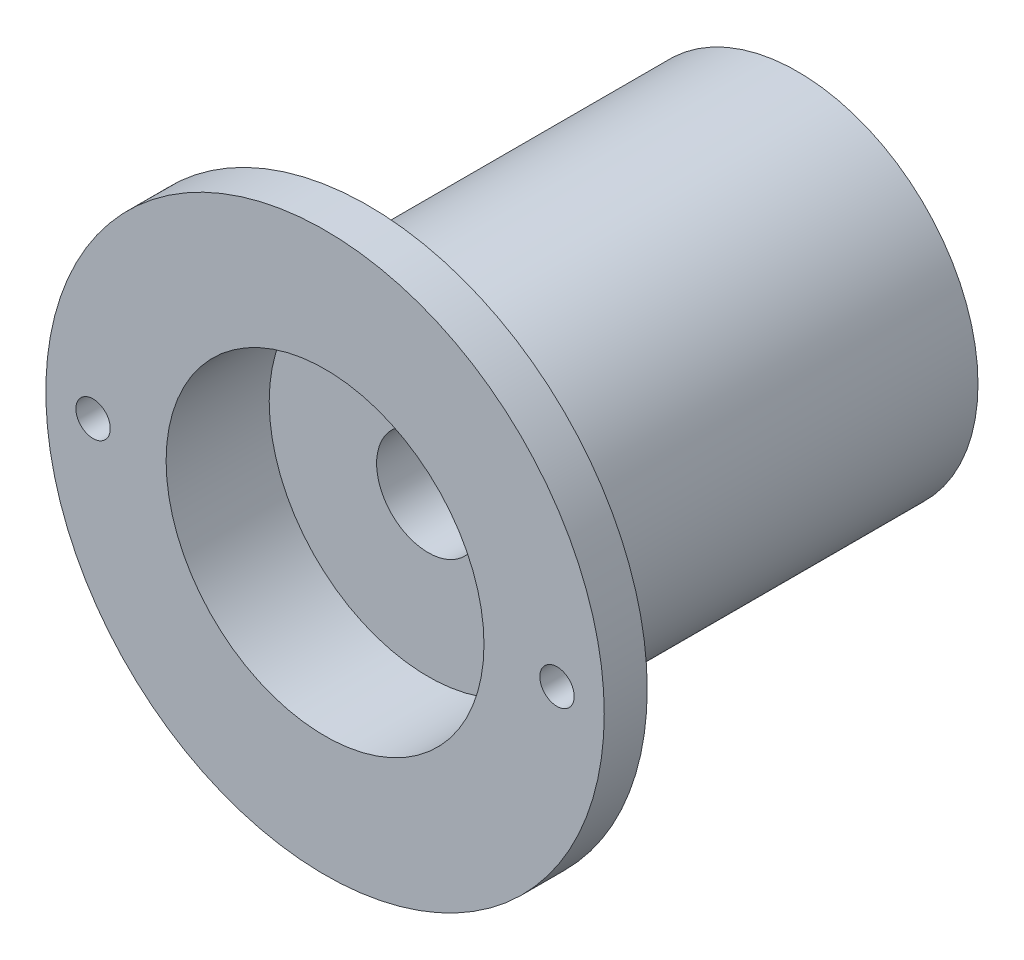
ISO-10303-21;
HEADER;
FILE_DESCRIPTION(('STEP AP214'),'2;1');
FILE_NAME('part.step','',(''),(''),'','','');
FILE_SCHEMA(('AUTOMOTIVE_DESIGN { 1 0 10303 214 1 1 1 1 }'));
ENDSEC;
DATA;
#1=APPLICATION_CONTEXT('core data for automotive mechanical design processes');
#2=APPLICATION_PROTOCOL_DEFINITION('international standard','automotive_design',2000,#1);
#3=PRODUCT_CONTEXT('',#1,'mechanical');
#4=PRODUCT('Part','Part','',(#3));
#5=PRODUCT_RELATED_PRODUCT_CATEGORY('part','',(#4));
#6=PRODUCT_DEFINITION_FORMATION('','',#4);
#7=PRODUCT_DEFINITION_CONTEXT('part definition',#1,'design');
#8=PRODUCT_DEFINITION('design','',#6,#7);
#9=PRODUCT_DEFINITION_SHAPE('','',#8);
#10=(LENGTH_UNIT() NAMED_UNIT(*) SI_UNIT(.MILLI.,.METRE.));
#11=(NAMED_UNIT(*) PLANE_ANGLE_UNIT() SI_UNIT($,.RADIAN.));
#12=(NAMED_UNIT(*) SI_UNIT($,.STERADIAN.) SOLID_ANGLE_UNIT());
#13=UNCERTAINTY_MEASURE_WITH_UNIT(LENGTH_MEASURE(1.E-05),#10,'distance_accuracy_value','');
#14=(GEOMETRIC_REPRESENTATION_CONTEXT(3) GLOBAL_UNCERTAINTY_ASSIGNED_CONTEXT((#13)) GLOBAL_UNIT_ASSIGNED_CONTEXT((#10,
#11,#12)) REPRESENTATION_CONTEXT('',''));
#15=CARTESIAN_POINT('',(0.,0.,0.));
#16=DIRECTION('',(0.,0.,1.));
#17=DIRECTION('',(1.,0.,0.));
#18=AXIS2_PLACEMENT_3D('',#15,#16,#17);
#19=CARTESIAN_POINT('',(0.,0.,-6.00000000000003));
#20=DIRECTION('',(0.,0.,1.));
#21=DIRECTION('',(1.,0.,0.));
#22=AXIS2_PLACEMENT_3D('',#19,#20,#21);
#23=CYLINDRICAL_SURFACE('',#22,6.);
#24=CARTESIAN_POINT('',(0.,0.,43.));
#25=DIRECTION('',(0.,0.,1.));
#26=DIRECTION('',(1.,0.,0.));
#27=AXIS2_PLACEMENT_3D('',#24,#25,#26);
#28=CIRCLE('',#27,6.);
#29=CARTESIAN_POINT('',(6.,0.,43.));
#30=VERTEX_POINT('',#29);
#31=EDGE_CURVE('E58',#30,#30,#28,.T.);
#32=CARTESIAN_POINT('',(0.,0.,12.));
#33=DIRECTION('',(0.,0.,-1.));
#34=DIRECTION('',(-1.,0.,0.));
#35=AXIS2_PLACEMENT_3D('',#32,#33,#34);
#36=CIRCLE('',#35,6.);
#37=CARTESIAN_POINT('',(6.,0.,12.));
#38=VERTEX_POINT('',#37);
#39=EDGE_CURVE('E38',#38,#38,#36,.F.);
#40=CARTESIAN_POINT('',(6.,0.,43.));
#41=CARTESIAN_POINT('',(6.,0.,42.6770833333333));
#42=CARTESIAN_POINT('',(6.,0.,42.3541666666667));
#43=CARTESIAN_POINT('',(6.,0.,41.7083333333333));
#44=CARTESIAN_POINT('',(6.,0.,41.3854166666667));
#45=CARTESIAN_POINT('',(6.,0.,40.7395833333333));
#46=CARTESIAN_POINT('',(6.,0.,40.4166666666667));
#47=CARTESIAN_POINT('',(6.,0.,39.7708333333333));
#48=CARTESIAN_POINT('',(6.,0.,39.4479166666667));
#49=CARTESIAN_POINT('',(6.,0.,38.8020833333333));
#50=CARTESIAN_POINT('',(6.,0.,38.4791666666667));
#51=CARTESIAN_POINT('',(6.,0.,37.8333333333333));
#52=CARTESIAN_POINT('',(6.,0.,37.5104166666667));
#53=CARTESIAN_POINT('',(6.,0.,36.8645833333333));
#54=CARTESIAN_POINT('',(6.,0.,36.5416666666667));
#55=CARTESIAN_POINT('',(6.,0.,35.8958333333333));
#56=CARTESIAN_POINT('',(6.,0.,35.5729166666667));
#57=CARTESIAN_POINT('',(6.,0.,34.9270833333333));
#58=CARTESIAN_POINT('',(6.,0.,34.6041666666667));
#59=CARTESIAN_POINT('',(6.,0.,33.9583333333333));
#60=CARTESIAN_POINT('',(6.,0.,33.6354166666667));
#61=CARTESIAN_POINT('',(6.,0.,32.9895833333333));
#62=CARTESIAN_POINT('',(6.,0.,32.6666666666667));
#63=CARTESIAN_POINT('',(6.,0.,32.0208333333333));
#64=CARTESIAN_POINT('',(6.,0.,31.6979166666667));
#65=CARTESIAN_POINT('',(6.,0.,31.0520833333333));
#66=CARTESIAN_POINT('',(6.,0.,30.7291666666667));
#67=CARTESIAN_POINT('',(6.,0.,30.0833333333333));
#68=CARTESIAN_POINT('',(6.,0.,29.7604166666667));
#69=CARTESIAN_POINT('',(6.,0.,29.1145833333333));
#70=CARTESIAN_POINT('',(6.,0.,28.7916666666667));
#71=CARTESIAN_POINT('',(6.,0.,28.1458333333333));
#72=CARTESIAN_POINT('',(6.,0.,27.8229166666667));
#73=CARTESIAN_POINT('',(6.,0.,27.1770833333333));
#74=CARTESIAN_POINT('',(6.,0.,26.8541666666667));
#75=CARTESIAN_POINT('',(6.,0.,26.2083333333333));
#76=CARTESIAN_POINT('',(6.,0.,25.8854166666667));
#77=CARTESIAN_POINT('',(6.,0.,25.2395833333333));
#78=CARTESIAN_POINT('',(6.,0.,24.9166666666667));
#79=CARTESIAN_POINT('',(6.,0.,24.2708333333333));
#80=CARTESIAN_POINT('',(6.,0.,23.9479166666667));
#81=CARTESIAN_POINT('',(6.,0.,23.3020833333333));
#82=CARTESIAN_POINT('',(6.,0.,22.9791666666667));
#83=CARTESIAN_POINT('',(6.,0.,22.3333333333333));
#84=CARTESIAN_POINT('',(6.,0.,22.0104166666667));
#85=CARTESIAN_POINT('',(6.,0.,21.3645833333333));
#86=CARTESIAN_POINT('',(6.,0.,21.0416666666667));
#87=CARTESIAN_POINT('',(6.,0.,20.3958333333333));
#88=CARTESIAN_POINT('',(6.,0.,20.0729166666667));
#89=CARTESIAN_POINT('',(6.,0.,19.4270833333333));
#90=CARTESIAN_POINT('',(6.,0.,19.1041666666667));
#91=CARTESIAN_POINT('',(6.,0.,18.4583333333333));
#92=CARTESIAN_POINT('',(6.,0.,18.1354166666667));
#93=CARTESIAN_POINT('',(6.,0.,17.4895833333333));
#94=CARTESIAN_POINT('',(6.,0.,17.1666666666667));
#95=CARTESIAN_POINT('',(6.,0.,16.5208333333333));
#96=CARTESIAN_POINT('',(6.,0.,16.1979166666667));
#97=CARTESIAN_POINT('',(6.,0.,15.5520833333333));
#98=CARTESIAN_POINT('',(6.,0.,15.2291666666667));
#99=CARTESIAN_POINT('',(6.,0.,14.5833333333333));
#100=CARTESIAN_POINT('',(6.,0.,14.2604166666667));
#101=CARTESIAN_POINT('',(6.,0.,13.6145833333333));
#102=CARTESIAN_POINT('',(6.,0.,13.2916666666667));
#103=CARTESIAN_POINT('',(6.,0.,12.6458333333333));
#104=CARTESIAN_POINT('',(6.,0.,12.3229166666667));
#105=CARTESIAN_POINT('',(6.,0.,12.));
#106=B_SPLINE_CURVE_WITH_KNOTS('',3,(#40,#41,#42,#43,#44,#45,#46,#47,#48,#49,#50,#51,#52,#53,
#54,#55,#56,#57,#58,#59,#60,#61,#62,#63,#64,#65,#66,#67,#68,#69,#70,#71,#72,#73,#74,#75,#76,#77,
#78,#79,#80,#81,#82,#83,#84,#85,#86,#87,#88,#89,#90,#91,#92,#93,#94,#95,#96,#97,#98,#99,#100,
#101,#102,#103,#104,#105),.UNSPECIFIED.,.F.,.F.,(4,2,2,2,2,2,2,2,2,2,2,2,2,2,2,2,2,2,2,2,2,2,2,
2,2,2,2,2,2,2,2,2,4),(0.,0.968749999999997,1.9375,2.90625,3.875,4.84375,5.8125,6.78125,7.75,
8.71875,9.6875,10.65625,11.625,12.59375,13.5625,14.53125,15.5,16.46875,17.4375,18.40625,19.375,
20.34375,21.3125,22.28125,23.25,24.21875,25.1875,26.15625,27.125,28.09375,29.0625,30.03125,31.),.UNSPECIFIED.);
#107=EDGE_CURVE('BSEAM34',#30,#38,#106,.T.);
#108=ORIENTED_EDGE('',*,*,#31,.T.);
#109=ORIENTED_EDGE('',*,*,#39,.F.);
#110=ORIENTED_EDGE('',*,*,#107,.T.);
#111=ORIENTED_EDGE('',*,*,#107,.F.);
#112=EDGE_LOOP('',(#108,#110,#109,#111));
#113=FACE_BOUND('',#112,.T.);
#114=ADVANCED_FACE('F34',(#113),#23,.F.);
#115=CARTESIAN_POINT('',(0.,0.,50.));
#116=DIRECTION('',(0.,0.,-1.));
#117=DIRECTION('',(-1.,0.,0.));
#118=AXIS2_PLACEMENT_3D('',#115,#116,#117);
#119=CYLINDRICAL_SURFACE('',#118,21.);
#120=CARTESIAN_POINT('',(0.,0.,50.));
#121=DIRECTION('',(0.,0.,1.));
#122=DIRECTION('',(1.,0.,0.));
#123=AXIS2_PLACEMENT_3D('',#120,#121,#122);
#124=CIRCLE('',#123,21.);
#125=CARTESIAN_POINT('',(21.,0.,50.));
#126=VERTEX_POINT('',#125);
#127=EDGE_CURVE('E10',#126,#126,#124,.T.);
#128=ORIENTED_EDGE('',*,*,#127,.F.);
#129=EDGE_LOOP('',(#128));
#130=FACE_BOUND('',#129,.T.);
#131=CARTESIAN_POINT('',(0.,0.,0.));
#132=DIRECTION('',(0.,0.,1.));
#133=DIRECTION('',(1.,0.,0.));
#134=AXIS2_PLACEMENT_3D('',#131,#132,#133);
#135=CIRCLE('',#134,21.);
#136=CARTESIAN_POINT('',(21.,0.,0.));
#137=VERTEX_POINT('',#136);
#138=EDGE_CURVE('E42',#137,#137,#135,.T.);
#139=ORIENTED_EDGE('',*,*,#138,.T.);
#140=EDGE_LOOP('',(#139));
#141=FACE_BOUND('',#140,.T.);
#142=ADVANCED_FACE('F36',(#130,#141),#119,.T.);
#143=CARTESIAN_POINT('',(0.,0.,0.));
#144=DIRECTION('',(0.,0.,1.));
#145=DIRECTION('',(1.,0.,0.));
#146=AXIS2_PLACEMENT_3D('',#143,#144,#145);
#147=PLANE('',#146);
#148=CARTESIAN_POINT('',(0.,0.,0.));
#149=DIRECTION('',(0.,0.,-1.));
#150=DIRECTION('',(-1.,0.,0.));
#151=AXIS2_PLACEMENT_3D('',#148,#149,#150);
#152=CIRCLE('',#151,18.5);
#153=CARTESIAN_POINT('',(-18.5,0.,0.));
#154=VERTEX_POINT('',#153);
#155=EDGE_CURVE('E63',#154,#154,#152,.T.);
#156=ORIENTED_EDGE('',*,*,#155,.F.);
#157=EDGE_LOOP('',(#156));
#158=FACE_BOUND('',#157,.T.);
#159=ORIENTED_EDGE('',*,*,#138,.F.);
#160=EDGE_LOOP('',(#159));
#161=FACE_BOUND('',#160,.T.);
#162=ADVANCED_FACE('F96',(#158,#161),#147,.F.);
#163=CARTESIAN_POINT('',(0.,0.,55.));
#164=DIRECTION('',(0.,0.,-1.));
#165=DIRECTION('',(-1.,0.,0.));
#166=AXIS2_PLACEMENT_3D('',#163,#164,#165);
#167=CYLINDRICAL_SURFACE('',#166,32.5);
#168=CARTESIAN_POINT('',(0.,0.,55.));
#169=DIRECTION('',(0.,0.,1.));
#170=DIRECTION('',(1.,0.,0.));
#171=AXIS2_PLACEMENT_3D('',#168,#169,#170);
#172=CIRCLE('',#171,32.5);
#173=CARTESIAN_POINT('',(32.5,0.,55.));
#174=VERTEX_POINT('',#173);
#175=EDGE_CURVE('E47',#174,#174,#172,.T.);
#176=ORIENTED_EDGE('',*,*,#175,.F.);
#177=EDGE_LOOP('',(#176));
#178=FACE_BOUND('',#177,.T.);
#179=CARTESIAN_POINT('',(0.,0.,50.));
#180=DIRECTION('',(0.,0.,1.));
#181=DIRECTION('',(1.,0.,0.));
#182=AXIS2_PLACEMENT_3D('',#179,#180,#181);
#183=CIRCLE('',#182,32.5);
#184=CARTESIAN_POINT('',(32.5,0.,50.));
#185=VERTEX_POINT('',#184);
#186=EDGE_CURVE('E49',#185,#185,#183,.T.);
#187=ORIENTED_EDGE('',*,*,#186,.T.);
#188=EDGE_LOOP('',(#187));
#189=FACE_BOUND('',#188,.T.);
#190=ADVANCED_FACE('F94',(#178,#189),#167,.T.);
#191=CARTESIAN_POINT('',(0.,0.,55.));
#192=DIRECTION('',(0.,0.,1.));
#193=DIRECTION('',(1.,0.,0.));
#194=AXIS2_PLACEMENT_3D('',#191,#192,#193);
#195=PLANE('',#194);
#196=CARTESIAN_POINT('',(-27.,0.,55.));
#197=DIRECTION('',(0.,0.,1.));
#198=DIRECTION('',(1.,0.,0.));
#199=AXIS2_PLACEMENT_3D('',#196,#197,#198);
#200=CIRCLE('',#199,2.);
#201=CARTESIAN_POINT('',(-25.,0.,55.));
#202=VERTEX_POINT('',#201);
#203=EDGE_CURVE('E67',#202,#202,#200,.T.);
#204=ORIENTED_EDGE('',*,*,#203,.F.);
#205=EDGE_LOOP('',(#204));
#206=FACE_BOUND('',#205,.T.);
#207=CARTESIAN_POINT('',(27.,0.,55.));
#208=DIRECTION('',(0.,0.,1.));
#209=DIRECTION('',(1.,0.,0.));
#210=AXIS2_PLACEMENT_3D('',#207,#208,#209);
#211=CIRCLE('',#210,2.);
#212=CARTESIAN_POINT('',(29.,0.,55.));
#213=VERTEX_POINT('',#212);
#214=EDGE_CURVE('E72',#213,#213,#211,.T.);
#215=ORIENTED_EDGE('',*,*,#214,.F.);
#216=EDGE_LOOP('',(#215));
#217=FACE_BOUND('',#216,.T.);
#218=CARTESIAN_POINT('',(0.,0.,55.));
#219=DIRECTION('',(0.,0.,1.));
#220=DIRECTION('',(1.,0.,0.));
#221=AXIS2_PLACEMENT_3D('',#218,#219,#220);
#222=CIRCLE('',#221,18.5);
#223=CARTESIAN_POINT('',(18.5,0.,55.));
#224=VERTEX_POINT('',#223);
#225=EDGE_CURVE('E55',#224,#224,#222,.T.);
#226=ORIENTED_EDGE('',*,*,#225,.F.);
#227=EDGE_LOOP('',(#226));
#228=FACE_BOUND('',#227,.T.);
#229=ORIENTED_EDGE('',*,*,#175,.T.);
#230=EDGE_LOOP('',(#229));
#231=FACE_BOUND('',#230,.T.);
#232=ADVANCED_FACE('F88',(#206,#217,#228,#231),#195,.T.);
#233=CARTESIAN_POINT('',(0.,0.,50.));
#234=DIRECTION('',(0.,0.,1.));
#235=DIRECTION('',(1.,0.,0.));
#236=AXIS2_PLACEMENT_3D('',#233,#234,#235);
#237=PLANE('',#236);
#238=CARTESIAN_POINT('',(-27.,0.,50.));
#239=DIRECTION('',(0.,0.,-1.));
#240=DIRECTION('',(-1.,0.,0.));
#241=AXIS2_PLACEMENT_3D('',#238,#239,#240);
#242=CIRCLE('',#241,2.);
#243=CARTESIAN_POINT('',(-29.,0.,50.));
#244=VERTEX_POINT('',#243);
#245=EDGE_CURVE('E75',#244,#244,#242,.T.);
#246=ORIENTED_EDGE('',*,*,#245,.F.);
#247=EDGE_LOOP('',(#246));
#248=FACE_BOUND('',#247,.T.);
#249=CARTESIAN_POINT('',(27.,0.,50.));
#250=DIRECTION('',(0.,0.,-1.));
#251=DIRECTION('',(-1.,0.,0.));
#252=AXIS2_PLACEMENT_3D('',#249,#250,#251);
#253=CIRCLE('',#252,2.);
#254=CARTESIAN_POINT('',(25.,0.,50.));
#255=VERTEX_POINT('',#254);
#256=EDGE_CURVE('E76',#255,#255,#253,.T.);
#257=ORIENTED_EDGE('',*,*,#256,.F.);
#258=EDGE_LOOP('',(#257));
#259=FACE_BOUND('',#258,.T.);
#260=ORIENTED_EDGE('',*,*,#127,.T.);
#261=EDGE_LOOP('',(#260));
#262=FACE_BOUND('',#261,.T.);
#263=ORIENTED_EDGE('',*,*,#186,.F.);
#264=EDGE_LOOP('',(#263));
#265=FACE_BOUND('',#264,.T.);
#266=ADVANCED_FACE('F84',(#248,#259,#262,#265),#237,.F.);
#267=CARTESIAN_POINT('',(0.,0.,43.));
#268=DIRECTION('',(0.,0.,1.));
#269=DIRECTION('',(1.,0.,0.));
#270=AXIS2_PLACEMENT_3D('',#267,#268,#269);
#271=CYLINDRICAL_SURFACE('',#270,18.5);
#272=CARTESIAN_POINT('',(0.,0.,43.));
#273=DIRECTION('',(0.,0.,1.));
#274=DIRECTION('',(1.,0.,0.));
#275=AXIS2_PLACEMENT_3D('',#272,#273,#274);
#276=CIRCLE('',#275,18.5);
#277=CARTESIAN_POINT('',(18.5,0.,43.));
#278=VERTEX_POINT('',#277);
#279=EDGE_CURVE('E52',#278,#278,#276,.T.);
#280=ORIENTED_EDGE('',*,*,#279,.F.);
#281=EDGE_LOOP('',(#280));
#282=FACE_BOUND('',#281,.T.);
#283=ORIENTED_EDGE('',*,*,#225,.T.);
#284=EDGE_LOOP('',(#283));
#285=FACE_BOUND('',#284,.T.);
#286=ADVANCED_FACE('F87',(#282,#285),#271,.F.);
#287=CARTESIAN_POINT('',(0.,0.,43.));
#288=DIRECTION('',(0.,0.,1.));
#289=DIRECTION('',(1.,0.,0.));
#290=AXIS2_PLACEMENT_3D('',#287,#288,#289);
#291=PLANE('',#290);
#292=ORIENTED_EDGE('',*,*,#31,.F.);
#293=EDGE_LOOP('',(#292));
#294=FACE_BOUND('',#293,.T.);
#295=ORIENTED_EDGE('',*,*,#279,.T.);
#296=EDGE_LOOP('',(#295));
#297=FACE_BOUND('',#296,.T.);
#298=ADVANCED_FACE('F119',(#294,#297),#291,.T.);
#299=CARTESIAN_POINT('',(0.,0.,12.));
#300=DIRECTION('',(0.,0.,-1.));
#301=DIRECTION('',(-1.,0.,0.));
#302=AXIS2_PLACEMENT_3D('',#299,#300,#301);
#303=PLANE('',#302);
#304=CARTESIAN_POINT('',(0.,0.,12.));
#305=DIRECTION('',(0.,0.,-1.));
#306=DIRECTION('',(-1.,0.,0.));
#307=AXIS2_PLACEMENT_3D('',#304,#305,#306);
#308=CIRCLE('',#307,18.5);
#309=CARTESIAN_POINT('',(-18.5,0.,12.));
#310=VERTEX_POINT('',#309);
#311=EDGE_CURVE('E66',#310,#310,#308,.T.);
#312=ORIENTED_EDGE('',*,*,#311,.T.);
#313=EDGE_LOOP('',(#312));
#314=FACE_BOUND('',#313,.T.);
#315=ORIENTED_EDGE('',*,*,#39,.T.);
#316=EDGE_LOOP('',(#315));
#317=FACE_BOUND('',#316,.T.);
#318=ADVANCED_FACE('F122',(#314,#317),#303,.T.);
#319=CARTESIAN_POINT('',(0.,0.,12.));
#320=DIRECTION('',(0.,0.,-1.));
#321=DIRECTION('',(-1.,0.,0.));
#322=AXIS2_PLACEMENT_3D('',#319,#320,#321);
#323=CYLINDRICAL_SURFACE('',#322,18.5);
#324=ORIENTED_EDGE('',*,*,#311,.F.);
#325=EDGE_LOOP('',(#324));
#326=FACE_BOUND('',#325,.T.);
#327=ORIENTED_EDGE('',*,*,#155,.T.);
#328=EDGE_LOOP('',(#327));
#329=FACE_BOUND('',#328,.T.);
#330=ADVANCED_FACE('F117',(#326,#329),#323,.F.);
#331=CARTESIAN_POINT('',(27.,0.,56.));
#332=DIRECTION('',(0.,0.,-1.));
#333=DIRECTION('',(-1.,0.,0.));
#334=AXIS2_PLACEMENT_3D('',#331,#332,#333);
#335=CYLINDRICAL_SURFACE('',#334,2.);
#336=ORIENTED_EDGE('',*,*,#214,.T.);
#337=EDGE_LOOP('',(#336));
#338=FACE_BOUND('',#337,.T.);
#339=ORIENTED_EDGE('',*,*,#256,.T.);
#340=EDGE_LOOP('',(#339));
#341=FACE_BOUND('',#340,.T.);
#342=ADVANCED_FACE('F153',(#338,#341),#335,.F.);
#343=CARTESIAN_POINT('',(-27.,0.,56.));
#344=DIRECTION('',(0.,0.,-1.));
#345=DIRECTION('',(-1.,0.,0.));
#346=AXIS2_PLACEMENT_3D('',#343,#344,#345);
#347=CYLINDRICAL_SURFACE('',#346,2.);
#348=ORIENTED_EDGE('',*,*,#203,.T.);
#349=EDGE_LOOP('',(#348));
#350=FACE_BOUND('',#349,.T.);
#351=ORIENTED_EDGE('',*,*,#245,.T.);
#352=EDGE_LOOP('',(#351));
#353=FACE_BOUND('',#352,.T.);
#354=ADVANCED_FACE('F82',(#350,#353),#347,.F.);
#355=CLOSED_SHELL('',(#114,#142,#162,#190,#232,#266,#286,#298,#318,#330,#342,#354));
#356=MANIFOLD_SOLID_BREP('B2',#355);
#357=ADVANCED_BREP_SHAPE_REPRESENTATION('',(#18,#356),#14);
#358=SHAPE_DEFINITION_REPRESENTATION(#9,#357);
ENDSEC;
END-ISO-10303-21;
